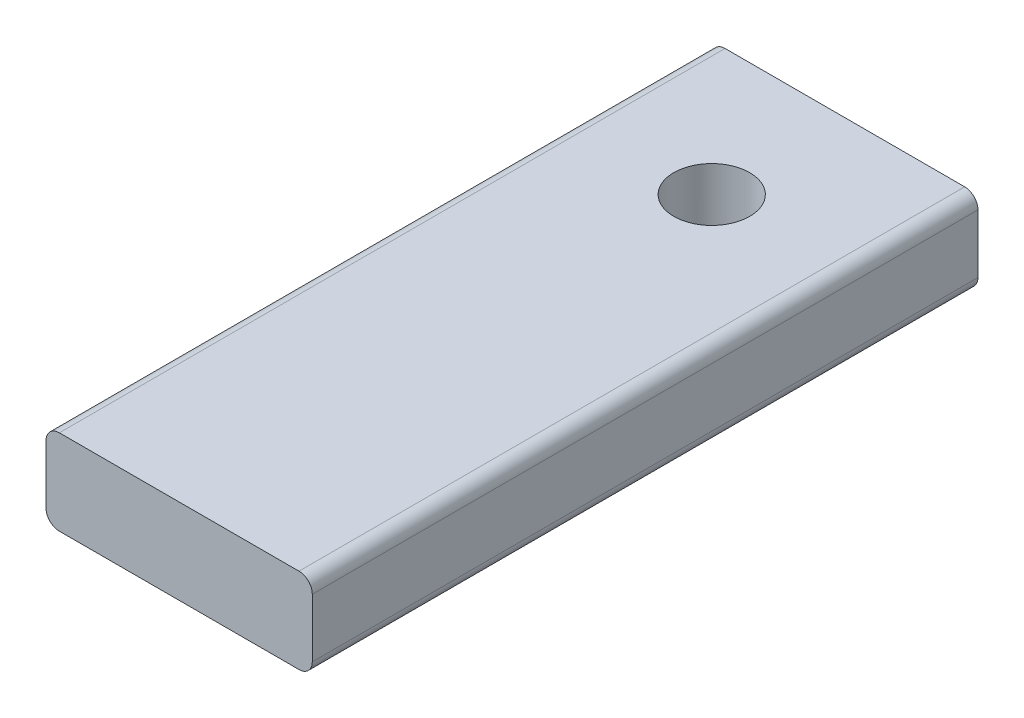
ISO-10303-21;
HEADER;
FILE_DESCRIPTION(('STEP AP214'),'2;1');
FILE_NAME('part.step','',(''),(''),'','','');
FILE_SCHEMA(('AUTOMOTIVE_DESIGN { 1 0 10303 214 1 1 1 1 }'));
ENDSEC;
DATA;
#1=APPLICATION_CONTEXT('core data for automotive mechanical design processes');
#2=APPLICATION_PROTOCOL_DEFINITION('international standard','automotive_design',2000,#1);
#3=PRODUCT_CONTEXT('',#1,'mechanical');
#4=PRODUCT('Part','Part','',(#3));
#5=PRODUCT_RELATED_PRODUCT_CATEGORY('part','',(#4));
#6=PRODUCT_DEFINITION_FORMATION('','',#4);
#7=PRODUCT_DEFINITION_CONTEXT('part definition',#1,'design');
#8=PRODUCT_DEFINITION('design','',#6,#7);
#9=PRODUCT_DEFINITION_SHAPE('','',#8);
#10=(LENGTH_UNIT() NAMED_UNIT(*) SI_UNIT(.MILLI.,.METRE.));
#11=(NAMED_UNIT(*) PLANE_ANGLE_UNIT() SI_UNIT($,.RADIAN.));
#12=(NAMED_UNIT(*) SI_UNIT($,.STERADIAN.) SOLID_ANGLE_UNIT());
#13=UNCERTAINTY_MEASURE_WITH_UNIT(LENGTH_MEASURE(1.E-05),#10,'distance_accuracy_value','');
#14=(GEOMETRIC_REPRESENTATION_CONTEXT(3) GLOBAL_UNCERTAINTY_ASSIGNED_CONTEXT((#13)) GLOBAL_UNIT_ASSIGNED_CONTEXT((#10,
#11,#12)) REPRESENTATION_CONTEXT('',''));
#15=CARTESIAN_POINT('',(0.,0.,0.));
#16=DIRECTION('',(0.,0.,1.));
#17=DIRECTION('',(1.,0.,0.));
#18=AXIS2_PLACEMENT_3D('',#15,#16,#17);
#19=CARTESIAN_POINT('',(-9.,-2.2,50.));
#20=DIRECTION('',(0.,0.,-1.));
#21=DIRECTION('',(-1.,0.,0.));
#22=AXIS2_PLACEMENT_3D('',#19,#20,#21);
#23=CYLINDRICAL_SURFACE('',#22,1.);
#24=CARTESIAN_POINT('',(-9.,-2.2,0.));
#25=DIRECTION('',(0.,0.,1.));
#26=DIRECTION('',(1.,0.,0.));
#27=AXIS2_PLACEMENT_3D('',#24,#25,#26);
#28=CIRCLE('',#27,1.);
#29=CARTESIAN_POINT('',(-10.,-2.2,0.));
#30=VERTEX_POINT('',#29);
#31=CARTESIAN_POINT('',(-9.,-3.2,0.));
#32=VERTEX_POINT('',#31);
#33=EDGE_CURVE('E136',#30,#32,#28,.T.);
#34=ORIENTED_EDGE('',*,*,#33,.T.);
#35=DIRECTION('',(0.,0.,-1.));
#36=VECTOR('',#35,1.);
#37=CARTESIAN_POINT('',(-9.,-3.2,50.));
#38=LINE('',#37,#36);
#39=CARTESIAN_POINT('',(-9.,-3.2,50.));
#40=VERTEX_POINT('',#39);
#41=EDGE_CURVE('E11',#40,#32,#38,.T.);
#42=ORIENTED_EDGE('',*,*,#41,.F.);
#43=CARTESIAN_POINT('',(-9.,-2.2,50.));
#44=DIRECTION('',(0.,0.,1.));
#45=DIRECTION('',(1.,0.,0.));
#46=AXIS2_PLACEMENT_3D('',#43,#44,#45);
#47=CIRCLE('',#46,1.);
#48=CARTESIAN_POINT('',(-10.,-2.2,50.));
#49=VERTEX_POINT('',#48);
#50=EDGE_CURVE('E151',#49,#40,#47,.T.);
#51=ORIENTED_EDGE('',*,*,#50,.F.);
#52=DIRECTION('',(0.,0.,-1.));
#53=VECTOR('',#52,1.);
#54=CARTESIAN_POINT('',(-10.,-2.2,50.));
#55=LINE('',#54,#53);
#56=EDGE_CURVE('E132',#49,#30,#55,.T.);
#57=ORIENTED_EDGE('',*,*,#56,.T.);
#58=EDGE_LOOP('',(#34,#42,#51,#57));
#59=FACE_BOUND('',#58,.T.);
#60=ADVANCED_FACE('F39',(#59),#23,.T.);
#61=CARTESIAN_POINT('',(-9.,-3.2,50.));
#62=DIRECTION('',(0.,1.,0.));
#63=DIRECTION('',(0.,0.,1.));
#64=AXIS2_PLACEMENT_3D('',#61,#62,#63);
#65=PLANE('',#64);
#66=CARTESIAN_POINT('',(0.,-3.2,10.));
#67=DIRECTION('',(0.,1.,0.));
#68=DIRECTION('',(0.,0.,1.));
#69=AXIS2_PLACEMENT_3D('',#66,#67,#68);
#70=CIRCLE('',#69,2.85);
#71=CARTESIAN_POINT('',(0.,-3.2,12.85));
#72=VERTEX_POINT('',#71);
#73=EDGE_CURVE('E140',#72,#72,#70,.F.);
#74=ORIENTED_EDGE('',*,*,#73,.F.);
#75=EDGE_LOOP('',(#74));
#76=FACE_BOUND('',#75,.T.);
#77=DIRECTION('',(1.,0.,0.));
#78=VECTOR('',#77,1.);
#79=CARTESIAN_POINT('',(-9.,-3.2,0.));
#80=LINE('',#79,#78);
#81=CARTESIAN_POINT('',(9.,-3.2,0.));
#82=VERTEX_POINT('',#81);
#83=EDGE_CURVE('E139',#32,#82,#80,.T.);
#84=ORIENTED_EDGE('',*,*,#83,.T.);
#85=DIRECTION('',(0.,0.,-1.));
#86=VECTOR('',#85,1.);
#87=CARTESIAN_POINT('',(9.,-3.2,50.));
#88=LINE('',#87,#86);
#89=CARTESIAN_POINT('',(9.,-3.2,50.));
#90=VERTEX_POINT('',#89);
#91=EDGE_CURVE('E48',#90,#82,#88,.T.);
#92=ORIENTED_EDGE('',*,*,#91,.F.);
#93=DIRECTION('',(1.,0.,0.));
#94=VECTOR('',#93,1.);
#95=CARTESIAN_POINT('',(-9.,-3.2,50.));
#96=LINE('',#95,#94);
#97=EDGE_CURVE('E99',#40,#90,#96,.T.);
#98=ORIENTED_EDGE('',*,*,#97,.F.);
#99=ORIENTED_EDGE('',*,*,#41,.T.);
#100=EDGE_LOOP('',(#84,#92,#98,#99));
#101=FACE_BOUND('',#100,.T.);
#102=ADVANCED_FACE('F205',(#76,#101),#65,.F.);
#103=CARTESIAN_POINT('',(9.,-2.2,50.));
#104=DIRECTION('',(0.,0.,-1.));
#105=DIRECTION('',(-1.,0.,0.));
#106=AXIS2_PLACEMENT_3D('',#103,#104,#105);
#107=CYLINDRICAL_SURFACE('',#106,1.);
#108=CARTESIAN_POINT('',(9.,-2.2,0.));
#109=DIRECTION('',(0.,0.,1.));
#110=DIRECTION('',(1.,0.,0.));
#111=AXIS2_PLACEMENT_3D('',#108,#109,#110);
#112=CIRCLE('',#111,1.);
#113=CARTESIAN_POINT('',(10.,-2.2,0.));
#114=VERTEX_POINT('',#113);
#115=EDGE_CURVE('E142',#82,#114,#112,.T.);
#116=ORIENTED_EDGE('',*,*,#115,.T.);
#117=DIRECTION('',(0.,0.,-1.));
#118=VECTOR('',#117,1.);
#119=CARTESIAN_POINT('',(10.,-2.2,50.));
#120=LINE('',#119,#118);
#121=CARTESIAN_POINT('',(10.,-2.2,50.));
#122=VERTEX_POINT('',#121);
#123=EDGE_CURVE('E158',#122,#114,#120,.T.);
#124=ORIENTED_EDGE('',*,*,#123,.F.);
#125=CARTESIAN_POINT('',(9.,-2.2,50.));
#126=DIRECTION('',(0.,0.,1.));
#127=DIRECTION('',(1.,0.,0.));
#128=AXIS2_PLACEMENT_3D('',#125,#126,#127);
#129=CIRCLE('',#128,1.);
#130=EDGE_CURVE('E167',#90,#122,#129,.T.);
#131=ORIENTED_EDGE('',*,*,#130,.F.);
#132=ORIENTED_EDGE('',*,*,#91,.T.);
#133=EDGE_LOOP('',(#116,#124,#131,#132));
#134=FACE_BOUND('',#133,.T.);
#135=ADVANCED_FACE('F165',(#134),#107,.T.);
#136=CARTESIAN_POINT('',(10.,-2.2,50.));
#137=DIRECTION('',(-1.,0.,0.));
#138=DIRECTION('',(0.,0.,1.));
#139=AXIS2_PLACEMENT_3D('',#136,#137,#138);
#140=PLANE('',#139);
#141=DIRECTION('',(0.,1.,0.));
#142=VECTOR('',#141,1.);
#143=CARTESIAN_POINT('',(10.,-2.2,0.));
#144=LINE('',#143,#142);
#145=CARTESIAN_POINT('',(10.,2.2,0.));
#146=VERTEX_POINT('',#145);
#147=EDGE_CURVE('E144',#114,#146,#144,.T.);
#148=ORIENTED_EDGE('',*,*,#147,.T.);
#149=DIRECTION('',(0.,0.,-1.));
#150=VECTOR('',#149,1.);
#151=CARTESIAN_POINT('',(10.,2.2,50.));
#152=LINE('',#151,#150);
#153=CARTESIAN_POINT('',(10.,2.2,50.));
#154=VERTEX_POINT('',#153);
#155=EDGE_CURVE('E155',#154,#146,#152,.T.);
#156=ORIENTED_EDGE('',*,*,#155,.F.);
#157=DIRECTION('',(0.,1.,0.));
#158=VECTOR('',#157,1.);
#159=CARTESIAN_POINT('',(10.,-2.2,50.));
#160=LINE('',#159,#158);
#161=EDGE_CURVE('E179',#122,#154,#160,.T.);
#162=ORIENTED_EDGE('',*,*,#161,.F.);
#163=ORIENTED_EDGE('',*,*,#123,.T.);
#164=EDGE_LOOP('',(#148,#156,#162,#163));
#165=FACE_BOUND('',#164,.T.);
#166=ADVANCED_FACE('F175',(#165),#140,.F.);
#167=CARTESIAN_POINT('',(9.,2.2,50.));
#168=DIRECTION('',(0.,0.,-1.));
#169=DIRECTION('',(-1.,0.,0.));
#170=AXIS2_PLACEMENT_3D('',#167,#168,#169);
#171=CYLINDRICAL_SURFACE('',#170,1.);
#172=CARTESIAN_POINT('',(9.,2.2,0.));
#173=DIRECTION('',(0.,0.,1.));
#174=DIRECTION('',(1.,0.,0.));
#175=AXIS2_PLACEMENT_3D('',#172,#173,#174);
#176=CIRCLE('',#175,1.);
#177=CARTESIAN_POINT('',(9.,3.2,0.));
#178=VERTEX_POINT('',#177);
#179=EDGE_CURVE('E146',#146,#178,#176,.T.);
#180=ORIENTED_EDGE('',*,*,#179,.T.);
#181=DIRECTION('',(0.,0.,-1.));
#182=VECTOR('',#181,1.);
#183=CARTESIAN_POINT('',(9.,3.2,50.));
#184=LINE('',#183,#182);
#185=CARTESIAN_POINT('',(9.,3.2,50.));
#186=VERTEX_POINT('',#185);
#187=EDGE_CURVE('E127',#186,#178,#184,.T.);
#188=ORIENTED_EDGE('',*,*,#187,.F.);
#189=CARTESIAN_POINT('',(9.,2.2,50.));
#190=DIRECTION('',(0.,0.,1.));
#191=DIRECTION('',(1.,0.,0.));
#192=AXIS2_PLACEMENT_3D('',#189,#190,#191);
#193=CIRCLE('',#192,1.);
#194=EDGE_CURVE('E118',#154,#186,#193,.T.);
#195=ORIENTED_EDGE('',*,*,#194,.F.);
#196=ORIENTED_EDGE('',*,*,#155,.T.);
#197=EDGE_LOOP('',(#180,#188,#195,#196));
#198=FACE_BOUND('',#197,.T.);
#199=ADVANCED_FACE('F178',(#198),#171,.T.);
#200=CARTESIAN_POINT('',(9.,3.2,50.));
#201=DIRECTION('',(0.,-1.,0.));
#202=DIRECTION('',(0.,0.,-1.));
#203=AXIS2_PLACEMENT_3D('',#200,#201,#202);
#204=PLANE('',#203);
#205=CARTESIAN_POINT('',(0.,3.2,10.));
#206=DIRECTION('',(0.,-1.,0.));
#207=DIRECTION('',(0.,0.,-1.));
#208=AXIS2_PLACEMENT_3D('',#205,#206,#207);
#209=CIRCLE('',#208,2.85);
#210=CARTESIAN_POINT('',(0.,3.2,7.15));
#211=VERTEX_POINT('',#210);
#212=EDGE_CURVE('E42',#211,#211,#209,.F.);
#213=ORIENTED_EDGE('',*,*,#212,.F.);
#214=EDGE_LOOP('',(#213));
#215=FACE_BOUND('',#214,.T.);
#216=DIRECTION('',(-1.,0.,0.));
#217=VECTOR('',#216,1.);
#218=CARTESIAN_POINT('',(9.,3.2,0.));
#219=LINE('',#218,#217);
#220=CARTESIAN_POINT('',(-9.,3.2,0.));
#221=VERTEX_POINT('',#220);
#222=EDGE_CURVE('E126',#178,#221,#219,.T.);
#223=ORIENTED_EDGE('',*,*,#222,.T.);
#224=DIRECTION('',(0.,0.,-1.));
#225=VECTOR('',#224,1.);
#226=CARTESIAN_POINT('',(-9.,3.2,50.));
#227=LINE('',#226,#225);
#228=CARTESIAN_POINT('',(-9.,3.2,50.));
#229=VERTEX_POINT('',#228);
#230=EDGE_CURVE('E123',#229,#221,#227,.T.);
#231=ORIENTED_EDGE('',*,*,#230,.F.);
#232=DIRECTION('',(-1.,0.,0.));
#233=VECTOR('',#232,1.);
#234=CARTESIAN_POINT('',(9.,3.2,50.));
#235=LINE('',#234,#233);
#236=EDGE_CURVE('E112',#186,#229,#235,.T.);
#237=ORIENTED_EDGE('',*,*,#236,.F.);
#238=ORIENTED_EDGE('',*,*,#187,.T.);
#239=EDGE_LOOP('',(#223,#231,#237,#238));
#240=FACE_BOUND('',#239,.T.);
#241=ADVANCED_FACE('F124',(#215,#240),#204,.F.);
#242=CARTESIAN_POINT('',(-9.,2.2,50.));
#243=DIRECTION('',(0.,0.,-1.));
#244=DIRECTION('',(-1.,0.,0.));
#245=AXIS2_PLACEMENT_3D('',#242,#243,#244);
#246=CYLINDRICAL_SURFACE('',#245,1.);
#247=CARTESIAN_POINT('',(-9.,2.2,0.));
#248=DIRECTION('',(0.,0.,1.));
#249=DIRECTION('',(1.,0.,0.));
#250=AXIS2_PLACEMENT_3D('',#247,#248,#249);
#251=CIRCLE('',#250,1.);
#252=CARTESIAN_POINT('',(-10.,2.2,0.));
#253=VERTEX_POINT('',#252);
#254=EDGE_CURVE('E85',#221,#253,#251,.T.);
#255=ORIENTED_EDGE('',*,*,#254,.T.);
#256=DIRECTION('',(0.,0.,-1.));
#257=VECTOR('',#256,1.);
#258=CARTESIAN_POINT('',(-10.,2.2,50.));
#259=LINE('',#258,#257);
#260=CARTESIAN_POINT('',(-10.,2.2,50.));
#261=VERTEX_POINT('',#260);
#262=EDGE_CURVE('E128',#261,#253,#259,.T.);
#263=ORIENTED_EDGE('',*,*,#262,.F.);
#264=CARTESIAN_POINT('',(-9.,2.2,50.));
#265=DIRECTION('',(0.,0.,1.));
#266=DIRECTION('',(1.,0.,0.));
#267=AXIS2_PLACEMENT_3D('',#264,#265,#266);
#268=CIRCLE('',#267,1.);
#269=EDGE_CURVE('E116',#229,#261,#268,.T.);
#270=ORIENTED_EDGE('',*,*,#269,.F.);
#271=ORIENTED_EDGE('',*,*,#230,.T.);
#272=EDGE_LOOP('',(#255,#263,#270,#271));
#273=FACE_BOUND('',#272,.T.);
#274=ADVANCED_FACE('F130',(#273),#246,.T.);
#275=CARTESIAN_POINT('',(-10.,2.2,50.));
#276=DIRECTION('',(1.,0.,0.));
#277=DIRECTION('',(0.,0.,-1.));
#278=AXIS2_PLACEMENT_3D('',#275,#276,#277);
#279=PLANE('',#278);
#280=DIRECTION('',(0.,-1.,0.));
#281=VECTOR('',#280,1.);
#282=CARTESIAN_POINT('',(-10.,2.2,0.));
#283=LINE('',#282,#281);
#284=EDGE_CURVE('E91',#253,#30,#283,.T.);
#285=ORIENTED_EDGE('',*,*,#284,.T.);
#286=ORIENTED_EDGE('',*,*,#56,.F.);
#287=DIRECTION('',(0.,-1.,0.));
#288=VECTOR('',#287,1.);
#289=CARTESIAN_POINT('',(-10.,2.2,50.));
#290=LINE('',#289,#288);
#291=EDGE_CURVE('E56',#261,#49,#290,.T.);
#292=ORIENTED_EDGE('',*,*,#291,.F.);
#293=ORIENTED_EDGE('',*,*,#262,.T.);
#294=EDGE_LOOP('',(#285,#286,#292,#293));
#295=FACE_BOUND('',#294,.T.);
#296=ADVANCED_FACE('F200',(#295),#279,.F.);
#297=CARTESIAN_POINT('',(-9.,-2.2,50.));
#298=DIRECTION('',(0.,0.,1.));
#299=DIRECTION('',(1.,0.,0.));
#300=AXIS2_PLACEMENT_3D('',#297,#298,#299);
#301=PLANE('',#300);
#302=ORIENTED_EDGE('',*,*,#50,.T.);
#303=ORIENTED_EDGE('',*,*,#97,.T.);
#304=ORIENTED_EDGE('',*,*,#130,.T.);
#305=ORIENTED_EDGE('',*,*,#161,.T.);
#306=ORIENTED_EDGE('',*,*,#194,.T.);
#307=ORIENTED_EDGE('',*,*,#236,.T.);
#308=ORIENTED_EDGE('',*,*,#269,.T.);
#309=ORIENTED_EDGE('',*,*,#291,.T.);
#310=EDGE_LOOP('',(#302,#303,#304,#305,#306,#307,#308,#309));
#311=FACE_BOUND('',#310,.T.);
#312=ADVANCED_FACE('F114',(#311),#301,.T.);
#313=CARTESIAN_POINT('',(-9.,-2.2,0.));
#314=DIRECTION('',(0.,0.,1.));
#315=DIRECTION('',(1.,0.,0.));
#316=AXIS2_PLACEMENT_3D('',#313,#314,#315);
#317=PLANE('',#316);
#318=ORIENTED_EDGE('',*,*,#33,.F.);
#319=ORIENTED_EDGE('',*,*,#284,.F.);
#320=ORIENTED_EDGE('',*,*,#254,.F.);
#321=ORIENTED_EDGE('',*,*,#222,.F.);
#322=ORIENTED_EDGE('',*,*,#179,.F.);
#323=ORIENTED_EDGE('',*,*,#147,.F.);
#324=ORIENTED_EDGE('',*,*,#115,.F.);
#325=ORIENTED_EDGE('',*,*,#83,.F.);
#326=EDGE_LOOP('',(#318,#319,#320,#321,#322,#323,#324,#325));
#327=FACE_BOUND('',#326,.T.);
#328=ADVANCED_FACE('F171',(#327),#317,.F.);
#329=CARTESIAN_POINT('',(0.,4.,10.));
#330=DIRECTION('',(0.,-1.,0.));
#331=DIRECTION('',(0.,0.,-1.));
#332=AXIS2_PLACEMENT_3D('',#329,#330,#331);
#333=CYLINDRICAL_SURFACE('',#332,2.85);
#334=ORIENTED_EDGE('',*,*,#212,.T.);
#335=EDGE_LOOP('',(#334));
#336=FACE_BOUND('',#335,.T.);
#337=ORIENTED_EDGE('',*,*,#73,.T.);
#338=EDGE_LOOP('',(#337));
#339=FACE_BOUND('',#338,.T.);
#340=ADVANCED_FACE('F191',(#336,#339),#333,.F.);
#341=CLOSED_SHELL('',(#60,#102,#135,#166,#199,#241,#274,#296,#312,#328,#340));
#342=MANIFOLD_SOLID_BREP('B2',#341);
#343=ADVANCED_BREP_SHAPE_REPRESENTATION('',(#18,#342),#14);
#344=SHAPE_DEFINITION_REPRESENTATION(#9,#343);
ENDSEC;
END-ISO-10303-21;
